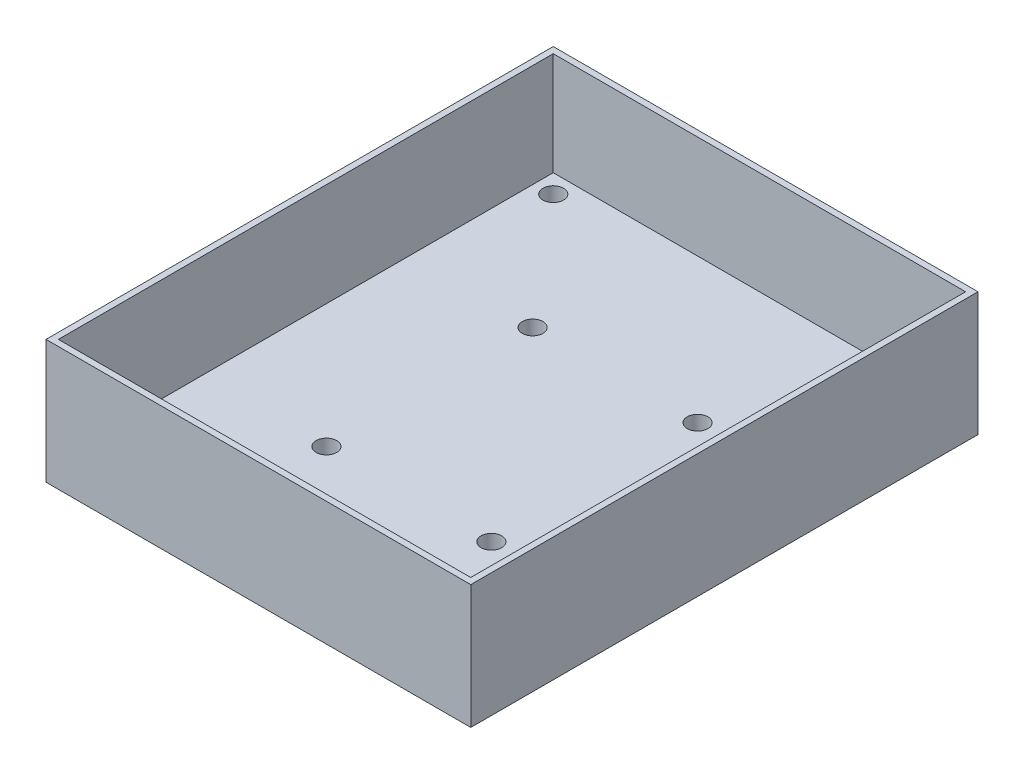
ISO-10303-21;
HEADER;
FILE_DESCRIPTION(('STEP AP214'),'2;1');
FILE_NAME('part.step','',(''),(''),'','','');
FILE_SCHEMA(('AUTOMOTIVE_DESIGN { 1 0 10303 214 1 1 1 1 }'));
ENDSEC;
DATA;
#1=APPLICATION_CONTEXT('core data for automotive mechanical design processes');
#2=APPLICATION_PROTOCOL_DEFINITION('international standard','automotive_design',2000,#1);
#3=PRODUCT_CONTEXT('',#1,'mechanical');
#4=PRODUCT('Part','Part','',(#3));
#5=PRODUCT_RELATED_PRODUCT_CATEGORY('part','',(#4));
#6=PRODUCT_DEFINITION_FORMATION('','',#4);
#7=PRODUCT_DEFINITION_CONTEXT('part definition',#1,'design');
#8=PRODUCT_DEFINITION('design','',#6,#7);
#9=PRODUCT_DEFINITION_SHAPE('','',#8);
#10=(LENGTH_UNIT() NAMED_UNIT(*) SI_UNIT(.MILLI.,.METRE.));
#11=(NAMED_UNIT(*) PLANE_ANGLE_UNIT() SI_UNIT($,.RADIAN.));
#12=(NAMED_UNIT(*) SI_UNIT($,.STERADIAN.) SOLID_ANGLE_UNIT());
#13=UNCERTAINTY_MEASURE_WITH_UNIT(LENGTH_MEASURE(1.E-05),#10,'distance_accuracy_value','');
#14=(GEOMETRIC_REPRESENTATION_CONTEXT(3) GLOBAL_UNCERTAINTY_ASSIGNED_CONTEXT((#13)) GLOBAL_UNIT_ASSIGNED_CONTEXT((#10,
#11,#12)) REPRESENTATION_CONTEXT('',''));
#15=CARTESIAN_POINT('',(0.,0.,0.));
#16=DIRECTION('',(0.,0.,1.));
#17=DIRECTION('',(1.,0.,0.));
#18=AXIS2_PLACEMENT_3D('',#15,#16,#17);
#19=CARTESIAN_POINT('',(103.,60.,-123.));
#20=DIRECTION('',(-1.,0.,0.));
#21=DIRECTION('',(0.,0.,1.));
#22=AXIS2_PLACEMENT_3D('',#19,#20,#21);
#23=PLANE('',#22);
#24=DIRECTION('',(0.,0.,-1.));
#25=VECTOR('',#24,1.);
#26=CARTESIAN_POINT('',(103.,0.,-123.));
#27=LINE('',#26,#25);
#28=CARTESIAN_POINT('',(103.,0.,123.));
#29=VERTEX_POINT('',#28);
#30=CARTESIAN_POINT('',(103.,0.,-123.));
#31=VERTEX_POINT('',#30);
#32=EDGE_CURVE('E146',#29,#31,#27,.T.);
#33=ORIENTED_EDGE('',*,*,#32,.T.);
#34=DIRECTION('',(0.,-1.,0.));
#35=VECTOR('',#34,1.);
#36=CARTESIAN_POINT('',(103.,60.,-123.));
#37=LINE('',#36,#35);
#38=CARTESIAN_POINT('',(103.,60.,-123.));
#39=VERTEX_POINT('',#38);
#40=EDGE_CURVE('E11',#39,#31,#37,.T.);
#41=ORIENTED_EDGE('',*,*,#40,.F.);
#42=DIRECTION('',(0.,0.,-1.));
#43=VECTOR('',#42,1.);
#44=CARTESIAN_POINT('',(103.,60.,-123.));
#45=LINE('',#44,#43);
#46=CARTESIAN_POINT('',(103.,60.,123.));
#47=VERTEX_POINT('',#46);
#48=EDGE_CURVE('E150',#47,#39,#45,.T.);
#49=ORIENTED_EDGE('',*,*,#48,.F.);
#50=DIRECTION('',(0.,-1.,0.));
#51=VECTOR('',#50,1.);
#52=CARTESIAN_POINT('',(103.,60.,123.));
#53=LINE('',#52,#51);
#54=EDGE_CURVE('E156',#47,#29,#53,.T.);
#55=ORIENTED_EDGE('',*,*,#54,.T.);
#56=EDGE_LOOP('',(#33,#41,#49,#55));
#57=FACE_BOUND('',#56,.T.);
#58=ADVANCED_FACE('F33',(#57),#23,.F.);
#59=CARTESIAN_POINT('',(-103.,60.,-123.));
#60=DIRECTION('',(0.,0.,1.));
#61=DIRECTION('',(1.,0.,0.));
#62=AXIS2_PLACEMENT_3D('',#59,#60,#61);
#63=PLANE('',#62);
#64=DIRECTION('',(-1.,0.,0.));
#65=VECTOR('',#64,1.);
#66=CARTESIAN_POINT('',(-103.,0.,-123.));
#67=LINE('',#66,#65);
#68=CARTESIAN_POINT('',(-103.,0.,-123.));
#69=VERTEX_POINT('',#68);
#70=EDGE_CURVE('E159',#31,#69,#67,.T.);
#71=ORIENTED_EDGE('',*,*,#70,.T.);
#72=DIRECTION('',(0.,-1.,0.));
#73=VECTOR('',#72,1.);
#74=CARTESIAN_POINT('',(-103.,60.,-123.));
#75=LINE('',#74,#73);
#76=CARTESIAN_POINT('',(-103.,60.,-123.));
#77=VERTEX_POINT('',#76);
#78=EDGE_CURVE('E41',#77,#69,#75,.T.);
#79=ORIENTED_EDGE('',*,*,#78,.F.);
#80=DIRECTION('',(-1.,0.,0.));
#81=VECTOR('',#80,1.);
#82=CARTESIAN_POINT('',(-103.,60.,-123.));
#83=LINE('',#82,#81);
#84=EDGE_CURVE('E86',#39,#77,#83,.T.);
#85=ORIENTED_EDGE('',*,*,#84,.F.);
#86=ORIENTED_EDGE('',*,*,#40,.T.);
#87=EDGE_LOOP('',(#71,#79,#85,#86));
#88=FACE_BOUND('',#87,.T.);
#89=ADVANCED_FACE('F264',(#88),#63,.F.);
#90=CARTESIAN_POINT('',(-103.,60.,-123.));
#91=DIRECTION('',(1.,0.,0.));
#92=DIRECTION('',(0.,0.,-1.));
#93=AXIS2_PLACEMENT_3D('',#90,#91,#92);
#94=PLANE('',#93);
#95=DIRECTION('',(0.,0.,1.));
#96=VECTOR('',#95,1.);
#97=CARTESIAN_POINT('',(-103.,0.,-123.));
#98=LINE('',#97,#96);
#99=CARTESIAN_POINT('',(-103.,0.,123.));
#100=VERTEX_POINT('',#99);
#101=EDGE_CURVE('E161',#69,#100,#98,.T.);
#102=ORIENTED_EDGE('',*,*,#101,.T.);
#103=DIRECTION('',(0.,-1.,0.));
#104=VECTOR('',#103,1.);
#105=CARTESIAN_POINT('',(-103.,60.,123.));
#106=LINE('',#105,#104);
#107=CARTESIAN_POINT('',(-103.,60.,123.));
#108=VERTEX_POINT('',#107);
#109=EDGE_CURVE('E165',#108,#100,#106,.T.);
#110=ORIENTED_EDGE('',*,*,#109,.F.);
#111=DIRECTION('',(0.,0.,1.));
#112=VECTOR('',#111,1.);
#113=CARTESIAN_POINT('',(-103.,60.,-123.));
#114=LINE('',#113,#112);
#115=EDGE_CURVE('E153',#77,#108,#114,.T.);
#116=ORIENTED_EDGE('',*,*,#115,.F.);
#117=ORIENTED_EDGE('',*,*,#78,.T.);
#118=EDGE_LOOP('',(#102,#110,#116,#117));
#119=FACE_BOUND('',#118,.T.);
#120=ADVANCED_FACE('F263',(#119),#94,.F.);
#121=CARTESIAN_POINT('',(-103.,60.,123.));
#122=DIRECTION('',(0.,0.,-1.));
#123=DIRECTION('',(-1.,0.,0.));
#124=AXIS2_PLACEMENT_3D('',#121,#122,#123);
#125=PLANE('',#124);
#126=DIRECTION('',(1.,0.,0.));
#127=VECTOR('',#126,1.);
#128=CARTESIAN_POINT('',(-103.,0.,123.));
#129=LINE('',#128,#127);
#130=EDGE_CURVE('E79',#100,#29,#129,.T.);
#131=ORIENTED_EDGE('',*,*,#130,.T.);
#132=ORIENTED_EDGE('',*,*,#54,.F.);
#133=DIRECTION('',(1.,0.,0.));
#134=VECTOR('',#133,1.);
#135=CARTESIAN_POINT('',(-103.,60.,123.));
#136=LINE('',#135,#134);
#137=EDGE_CURVE('E58',#108,#47,#136,.T.);
#138=ORIENTED_EDGE('',*,*,#137,.F.);
#139=ORIENTED_EDGE('',*,*,#109,.T.);
#140=EDGE_LOOP('',(#131,#132,#138,#139));
#141=FACE_BOUND('',#140,.T.);
#142=ADVANCED_FACE('F259',(#141),#125,.F.);
#143=CARTESIAN_POINT('',(0.,60.,0.));
#144=DIRECTION('',(0.,1.,0.));
#145=DIRECTION('',(0.,0.,1.));
#146=AXIS2_PLACEMENT_3D('',#143,#144,#145);
#147=PLANE('',#146);
#148=DIRECTION('',(0.,0.,-1.));
#149=VECTOR('',#148,1.);
#150=CARTESIAN_POINT('',(100.,60.,-120.));
#151=LINE('',#150,#149);
#152=CARTESIAN_POINT('',(100.,60.,120.));
#153=VERTEX_POINT('',#152);
#154=CARTESIAN_POINT('',(100.,60.,-120.));
#155=VERTEX_POINT('',#154);
#156=EDGE_CURVE('E49',#153,#155,#151,.T.);
#157=ORIENTED_EDGE('',*,*,#156,.F.);
#158=DIRECTION('',(1.,0.,0.));
#159=VECTOR('',#158,1.);
#160=CARTESIAN_POINT('',(-100.,60.,120.));
#161=LINE('',#160,#159);
#162=CARTESIAN_POINT('',(-100.,60.,120.));
#163=VERTEX_POINT('',#162);
#164=EDGE_CURVE('E128',#163,#153,#161,.T.);
#165=ORIENTED_EDGE('',*,*,#164,.F.);
#166=DIRECTION('',(0.,0.,1.));
#167=VECTOR('',#166,1.);
#168=CARTESIAN_POINT('',(-100.,60.,-120.));
#169=LINE('',#168,#167);
#170=CARTESIAN_POINT('',(-100.,60.,-120.));
#171=VERTEX_POINT('',#170);
#172=EDGE_CURVE('E131',#171,#163,#169,.T.);
#173=ORIENTED_EDGE('',*,*,#172,.F.);
#174=DIRECTION('',(-1.,0.,0.));
#175=VECTOR('',#174,1.);
#176=CARTESIAN_POINT('',(-100.,60.,-120.));
#177=LINE('',#176,#175);
#178=EDGE_CURVE('E140',#155,#171,#177,.T.);
#179=ORIENTED_EDGE('',*,*,#178,.F.);
#180=EDGE_LOOP('',(#157,#165,#173,#179));
#181=FACE_BOUND('',#180,.T.);
#182=ORIENTED_EDGE('',*,*,#48,.T.);
#183=ORIENTED_EDGE('',*,*,#84,.T.);
#184=ORIENTED_EDGE('',*,*,#115,.T.);
#185=ORIENTED_EDGE('',*,*,#137,.T.);
#186=EDGE_LOOP('',(#182,#183,#184,#185));
#187=FACE_BOUND('',#186,.T.);
#188=ADVANCED_FACE('F245',(#181,#187),#147,.T.);
#189=CARTESIAN_POINT('',(0.,0.,0.));
#190=DIRECTION('',(0.,1.,0.));
#191=DIRECTION('',(0.,0.,1.));
#192=AXIS2_PLACEMENT_3D('',#189,#190,#191);
#193=PLANE('',#192);
#194=CARTESIAN_POINT('',(40.,0.,50.));
#195=DIRECTION('',(0.,-1.,0.));
#196=DIRECTION('',(0.,0.,-1.));
#197=AXIS2_PLACEMENT_3D('',#194,#195,#196);
#198=CIRCLE('',#197,5.);
#199=CARTESIAN_POINT('',(40.,0.,45.));
#200=VERTEX_POINT('',#199);
#201=EDGE_CURVE('E225',#200,#200,#198,.T.);
#202=ORIENTED_EDGE('',*,*,#201,.F.);
#203=EDGE_LOOP('',(#202));
#204=FACE_BOUND('',#203,.T.);
#205=CARTESIAN_POINT('',(-40.,0.,50.));
#206=DIRECTION('',(0.,-1.,0.));
#207=DIRECTION('',(0.,0.,-1.));
#208=AXIS2_PLACEMENT_3D('',#205,#206,#207);
#209=CIRCLE('',#208,5.);
#210=CARTESIAN_POINT('',(-40.,0.,45.));
#211=VERTEX_POINT('',#210);
#212=EDGE_CURVE('E231',#211,#211,#209,.T.);
#213=ORIENTED_EDGE('',*,*,#212,.F.);
#214=EDGE_LOOP('',(#213));
#215=FACE_BOUND('',#214,.T.);
#216=CARTESIAN_POINT('',(-40.,0.,-50.));
#217=DIRECTION('',(0.,-1.,0.));
#218=DIRECTION('',(0.,0.,-1.));
#219=AXIS2_PLACEMENT_3D('',#216,#217,#218);
#220=CIRCLE('',#219,5.);
#221=CARTESIAN_POINT('',(-40.,0.,-55.));
#222=VERTEX_POINT('',#221);
#223=EDGE_CURVE('E220',#222,#222,#220,.T.);
#224=ORIENTED_EDGE('',*,*,#223,.F.);
#225=EDGE_LOOP('',(#224));
#226=FACE_BOUND('',#225,.T.);
#227=CARTESIAN_POINT('',(40.,0.,-50.));
#228=DIRECTION('',(0.,-1.,0.));
#229=DIRECTION('',(0.,0.,-1.));
#230=AXIS2_PLACEMENT_3D('',#227,#228,#229);
#231=CIRCLE('',#230,5.);
#232=CARTESIAN_POINT('',(40.,0.,-55.));
#233=VERTEX_POINT('',#232);
#234=EDGE_CURVE('E211',#233,#233,#231,.T.);
#235=ORIENTED_EDGE('',*,*,#234,.F.);
#236=EDGE_LOOP('',(#235));
#237=FACE_BOUND('',#236,.T.);
#238=CARTESIAN_POINT('',(-91.,0.,-111.));
#239=DIRECTION('',(0.,-1.,0.));
#240=DIRECTION('',(0.,0.,-1.));
#241=AXIS2_PLACEMENT_3D('',#238,#239,#240);
#242=CIRCLE('',#241,5.00000000000001);
#243=CARTESIAN_POINT('',(-91.,0.,-116.));
#244=VERTEX_POINT('',#243);
#245=EDGE_CURVE('E208',#244,#244,#242,.T.);
#246=ORIENTED_EDGE('',*,*,#245,.F.);
#247=EDGE_LOOP('',(#246));
#248=FACE_BOUND('',#247,.T.);
#249=CARTESIAN_POINT('',(91.,0.,-111.));
#250=DIRECTION('',(0.,-1.,0.));
#251=DIRECTION('',(0.,0.,-1.));
#252=AXIS2_PLACEMENT_3D('',#249,#250,#251);
#253=CIRCLE('',#252,5.00000000000001);
#254=CARTESIAN_POINT('',(91.,0.,-116.));
#255=VERTEX_POINT('',#254);
#256=EDGE_CURVE('E203',#255,#255,#253,.T.);
#257=ORIENTED_EDGE('',*,*,#256,.F.);
#258=EDGE_LOOP('',(#257));
#259=FACE_BOUND('',#258,.T.);
#260=CARTESIAN_POINT('',(91.,0.,111.));
#261=DIRECTION('',(0.,-1.,0.));
#262=DIRECTION('',(0.,0.,-1.));
#263=AXIS2_PLACEMENT_3D('',#260,#261,#262);
#264=CIRCLE('',#263,5.00000000000001);
#265=CARTESIAN_POINT('',(91.,0.,106.));
#266=VERTEX_POINT('',#265);
#267=EDGE_CURVE('E201',#266,#266,#264,.T.);
#268=ORIENTED_EDGE('',*,*,#267,.F.);
#269=EDGE_LOOP('',(#268));
#270=FACE_BOUND('',#269,.T.);
#271=CARTESIAN_POINT('',(-91.,0.,111.));
#272=DIRECTION('',(0.,-1.,0.));
#273=DIRECTION('',(0.,0.,-1.));
#274=AXIS2_PLACEMENT_3D('',#271,#272,#273);
#275=CIRCLE('',#274,5.00000000000001);
#276=CARTESIAN_POINT('',(-91.,0.,106.));
#277=VERTEX_POINT('',#276);
#278=EDGE_CURVE('E134',#277,#277,#275,.T.);
#279=ORIENTED_EDGE('',*,*,#278,.F.);
#280=EDGE_LOOP('',(#279));
#281=FACE_BOUND('',#280,.T.);
#282=ORIENTED_EDGE('',*,*,#32,.F.);
#283=ORIENTED_EDGE('',*,*,#130,.F.);
#284=ORIENTED_EDGE('',*,*,#101,.F.);
#285=ORIENTED_EDGE('',*,*,#70,.F.);
#286=EDGE_LOOP('',(#282,#283,#284,#285));
#287=FACE_BOUND('',#286,.T.);
#288=ADVANCED_FACE('F242',(#204,#215,#226,#237,#248,#259,#270,#281,#287),#193,.F.);
#289=CARTESIAN_POINT('',(100.,10.,-120.));
#290=DIRECTION('',(1.,0.,0.));
#291=DIRECTION('',(0.,0.,-1.));
#292=AXIS2_PLACEMENT_3D('',#289,#290,#291);
#293=PLANE('',#292);
#294=ORIENTED_EDGE('',*,*,#156,.T.);
#295=DIRECTION('',(0.,1.,0.));
#296=VECTOR('',#295,1.);
#297=CARTESIAN_POINT('',(100.,10.,-120.));
#298=LINE('',#297,#296);
#299=CARTESIAN_POINT('',(100.,10.,-120.));
#300=VERTEX_POINT('',#299);
#301=EDGE_CURVE('E106',#300,#155,#298,.T.);
#302=ORIENTED_EDGE('',*,*,#301,.F.);
#303=DIRECTION('',(0.,0.,-1.));
#304=VECTOR('',#303,1.);
#305=CARTESIAN_POINT('',(100.,10.,-120.));
#306=LINE('',#305,#304);
#307=CARTESIAN_POINT('',(100.,10.,120.));
#308=VERTEX_POINT('',#307);
#309=EDGE_CURVE('E110',#308,#300,#306,.T.);
#310=ORIENTED_EDGE('',*,*,#309,.F.);
#311=DIRECTION('',(0.,1.,0.));
#312=VECTOR('',#311,1.);
#313=CARTESIAN_POINT('',(100.,10.,120.));
#314=LINE('',#313,#312);
#315=EDGE_CURVE('E144',#308,#153,#314,.T.);
#316=ORIENTED_EDGE('',*,*,#315,.T.);
#317=EDGE_LOOP('',(#294,#302,#310,#316));
#318=FACE_BOUND('',#317,.T.);
#319=ADVANCED_FACE('F108',(#318),#293,.F.);
#320=CARTESIAN_POINT('',(-100.,10.,120.));
#321=DIRECTION('',(0.,0.,1.));
#322=DIRECTION('',(1.,0.,0.));
#323=AXIS2_PLACEMENT_3D('',#320,#321,#322);
#324=PLANE('',#323);
#325=ORIENTED_EDGE('',*,*,#164,.T.);
#326=ORIENTED_EDGE('',*,*,#315,.F.);
#327=DIRECTION('',(1.,0.,0.));
#328=VECTOR('',#327,1.);
#329=CARTESIAN_POINT('',(-100.,10.,120.));
#330=LINE('',#329,#328);
#331=CARTESIAN_POINT('',(-100.,10.,120.));
#332=VERTEX_POINT('',#331);
#333=EDGE_CURVE('E116',#332,#308,#330,.T.);
#334=ORIENTED_EDGE('',*,*,#333,.F.);
#335=DIRECTION('',(0.,1.,0.));
#336=VECTOR('',#335,1.);
#337=CARTESIAN_POINT('',(-100.,10.,120.));
#338=LINE('',#337,#336);
#339=EDGE_CURVE('E147',#332,#163,#338,.T.);
#340=ORIENTED_EDGE('',*,*,#339,.T.);
#341=EDGE_LOOP('',(#325,#326,#334,#340));
#342=FACE_BOUND('',#341,.T.);
#343=ADVANCED_FACE('F279',(#342),#324,.F.);
#344=CARTESIAN_POINT('',(-100.,10.,-120.));
#345=DIRECTION('',(-1.,0.,0.));
#346=DIRECTION('',(0.,0.,1.));
#347=AXIS2_PLACEMENT_3D('',#344,#345,#346);
#348=PLANE('',#347);
#349=ORIENTED_EDGE('',*,*,#172,.T.);
#350=ORIENTED_EDGE('',*,*,#339,.F.);
#351=DIRECTION('',(0.,0.,1.));
#352=VECTOR('',#351,1.);
#353=CARTESIAN_POINT('',(-100.,10.,-120.));
#354=LINE('',#353,#352);
#355=CARTESIAN_POINT('',(-100.,10.,-120.));
#356=VERTEX_POINT('',#355);
#357=EDGE_CURVE('E124',#356,#332,#354,.T.);
#358=ORIENTED_EDGE('',*,*,#357,.F.);
#359=DIRECTION('',(0.,1.,0.));
#360=VECTOR('',#359,1.);
#361=CARTESIAN_POINT('',(-100.,10.,-120.));
#362=LINE('',#361,#360);
#363=EDGE_CURVE('E115',#356,#171,#362,.T.);
#364=ORIENTED_EDGE('',*,*,#363,.T.);
#365=EDGE_LOOP('',(#349,#350,#358,#364));
#366=FACE_BOUND('',#365,.T.);
#367=ADVANCED_FACE('F282',(#366),#348,.F.);
#368=CARTESIAN_POINT('',(-100.,10.,-120.));
#369=DIRECTION('',(0.,0.,-1.));
#370=DIRECTION('',(-1.,0.,0.));
#371=AXIS2_PLACEMENT_3D('',#368,#369,#370);
#372=PLANE('',#371);
#373=ORIENTED_EDGE('',*,*,#178,.T.);
#374=ORIENTED_EDGE('',*,*,#363,.F.);
#375=DIRECTION('',(-1.,0.,0.));
#376=VECTOR('',#375,1.);
#377=CARTESIAN_POINT('',(-100.,10.,-120.));
#378=LINE('',#377,#376);
#379=EDGE_CURVE('E119',#300,#356,#378,.T.);
#380=ORIENTED_EDGE('',*,*,#379,.F.);
#381=ORIENTED_EDGE('',*,*,#301,.T.);
#382=EDGE_LOOP('',(#373,#374,#380,#381));
#383=FACE_BOUND('',#382,.T.);
#384=ADVANCED_FACE('F120',(#383),#372,.F.);
#385=CARTESIAN_POINT('',(0.,10.,0.));
#386=DIRECTION('',(0.,1.,0.));
#387=DIRECTION('',(0.,0.,1.));
#388=AXIS2_PLACEMENT_3D('',#385,#386,#387);
#389=PLANE('',#388);
#390=CARTESIAN_POINT('',(40.,10.,50.));
#391=DIRECTION('',(0.,-1.,0.));
#392=DIRECTION('',(0.,0.,-1.));
#393=AXIS2_PLACEMENT_3D('',#390,#391,#392);
#394=CIRCLE('',#393,5.);
#395=CARTESIAN_POINT('',(40.,10.,45.));
#396=VERTEX_POINT('',#395);
#397=EDGE_CURVE('E222',#396,#396,#394,.T.);
#398=ORIENTED_EDGE('',*,*,#397,.T.);
#399=EDGE_LOOP('',(#398));
#400=FACE_BOUND('',#399,.T.);
#401=CARTESIAN_POINT('',(-40.,10.,50.));
#402=DIRECTION('',(0.,-1.,0.));
#403=DIRECTION('',(0.,0.,-1.));
#404=AXIS2_PLACEMENT_3D('',#401,#402,#403);
#405=CIRCLE('',#404,5.);
#406=CARTESIAN_POINT('',(-40.,10.,45.));
#407=VERTEX_POINT('',#406);
#408=EDGE_CURVE('E228',#407,#407,#405,.T.);
#409=ORIENTED_EDGE('',*,*,#408,.T.);
#410=EDGE_LOOP('',(#409));
#411=FACE_BOUND('',#410,.T.);
#412=CARTESIAN_POINT('',(-40.,10.,-50.));
#413=DIRECTION('',(0.,-1.,0.));
#414=DIRECTION('',(0.,0.,-1.));
#415=AXIS2_PLACEMENT_3D('',#412,#413,#414);
#416=CIRCLE('',#415,5.);
#417=CARTESIAN_POINT('',(-40.,10.,-55.));
#418=VERTEX_POINT('',#417);
#419=EDGE_CURVE('E234',#418,#418,#416,.T.);
#420=ORIENTED_EDGE('',*,*,#419,.T.);
#421=EDGE_LOOP('',(#420));
#422=FACE_BOUND('',#421,.T.);
#423=CARTESIAN_POINT('',(40.,10.,-50.));
#424=DIRECTION('',(0.,-1.,0.));
#425=DIRECTION('',(0.,0.,-1.));
#426=AXIS2_PLACEMENT_3D('',#423,#424,#425);
#427=CIRCLE('',#426,5.);
#428=CARTESIAN_POINT('',(40.,10.,-55.));
#429=VERTEX_POINT('',#428);
#430=EDGE_CURVE('E214',#429,#429,#427,.T.);
#431=ORIENTED_EDGE('',*,*,#430,.T.);
#432=EDGE_LOOP('',(#431));
#433=FACE_BOUND('',#432,.T.);
#434=CARTESIAN_POINT('',(-91.,10.,-111.));
#435=DIRECTION('',(0.,1.,0.));
#436=DIRECTION('',(0.,0.,1.));
#437=AXIS2_PLACEMENT_3D('',#434,#435,#436);
#438=CIRCLE('',#437,5.00000000000001);
#439=CARTESIAN_POINT('',(-91.,10.,-106.));
#440=VERTEX_POINT('',#439);
#441=EDGE_CURVE('E36',#440,#440,#438,.T.);
#442=ORIENTED_EDGE('',*,*,#441,.F.);
#443=EDGE_LOOP('',(#442));
#444=FACE_BOUND('',#443,.T.);
#445=CARTESIAN_POINT('',(91.,10.,-111.));
#446=DIRECTION('',(0.,1.,0.));
#447=DIRECTION('',(0.,0.,1.));
#448=AXIS2_PLACEMENT_3D('',#445,#446,#447);
#449=CIRCLE('',#448,5.00000000000001);
#450=CARTESIAN_POINT('',(91.,10.,-106.));
#451=VERTEX_POINT('',#450);
#452=EDGE_CURVE('E174',#451,#451,#449,.T.);
#453=ORIENTED_EDGE('',*,*,#452,.F.);
#454=EDGE_LOOP('',(#453));
#455=FACE_BOUND('',#454,.T.);
#456=CARTESIAN_POINT('',(91.,10.,111.));
#457=DIRECTION('',(0.,1.,0.));
#458=DIRECTION('',(0.,0.,1.));
#459=AXIS2_PLACEMENT_3D('',#456,#457,#458);
#460=CIRCLE('',#459,5.00000000000001);
#461=CARTESIAN_POINT('',(91.,10.,116.));
#462=VERTEX_POINT('',#461);
#463=EDGE_CURVE('E172',#462,#462,#460,.T.);
#464=ORIENTED_EDGE('',*,*,#463,.F.);
#465=EDGE_LOOP('',(#464));
#466=FACE_BOUND('',#465,.T.);
#467=CARTESIAN_POINT('',(-91.,10.,111.));
#468=DIRECTION('',(0.,1.,0.));
#469=DIRECTION('',(0.,0.,1.));
#470=AXIS2_PLACEMENT_3D('',#467,#468,#469);
#471=CIRCLE('',#470,5.00000000000001);
#472=CARTESIAN_POINT('',(-91.,10.,116.));
#473=VERTEX_POINT('',#472);
#474=EDGE_CURVE('E169',#473,#473,#471,.T.);
#475=ORIENTED_EDGE('',*,*,#474,.F.);
#476=EDGE_LOOP('',(#475));
#477=FACE_BOUND('',#476,.T.);
#478=ORIENTED_EDGE('',*,*,#309,.T.);
#479=ORIENTED_EDGE('',*,*,#379,.T.);
#480=ORIENTED_EDGE('',*,*,#357,.T.);
#481=ORIENTED_EDGE('',*,*,#333,.T.);
#482=EDGE_LOOP('',(#478,#479,#480,#481));
#483=FACE_BOUND('',#482,.T.);
#484=ADVANCED_FACE('F126',(#400,#411,#422,#433,#444,#455,#466,#477,#483),#389,.T.);
#485=CARTESIAN_POINT('',(-91.,60.,111.));
#486=DIRECTION('',(0.,-1.,0.));
#487=DIRECTION('',(0.,0.,-1.));
#488=AXIS2_PLACEMENT_3D('',#485,#486,#487);
#489=CYLINDRICAL_SURFACE('',#488,5.00000000000001);
#490=ORIENTED_EDGE('',*,*,#474,.T.);
#491=EDGE_LOOP('',(#490));
#492=FACE_BOUND('',#491,.T.);
#493=ORIENTED_EDGE('',*,*,#278,.T.);
#494=EDGE_LOOP('',(#493));
#495=FACE_BOUND('',#494,.T.);
#496=ADVANCED_FACE('F186',(#492,#495),#489,.F.);
#497=CARTESIAN_POINT('',(91.,60.,111.));
#498=DIRECTION('',(0.,-1.,0.));
#499=DIRECTION('',(0.,0.,-1.));
#500=AXIS2_PLACEMENT_3D('',#497,#498,#499);
#501=CYLINDRICAL_SURFACE('',#500,5.00000000000001);
#502=ORIENTED_EDGE('',*,*,#463,.T.);
#503=EDGE_LOOP('',(#502));
#504=FACE_BOUND('',#503,.T.);
#505=ORIENTED_EDGE('',*,*,#267,.T.);
#506=EDGE_LOOP('',(#505));
#507=FACE_BOUND('',#506,.T.);
#508=ADVANCED_FACE('F196',(#504,#507),#501,.F.);
#509=CARTESIAN_POINT('',(91.,60.,-111.));
#510=DIRECTION('',(0.,-1.,0.));
#511=DIRECTION('',(0.,0.,-1.));
#512=AXIS2_PLACEMENT_3D('',#509,#510,#511);
#513=CYLINDRICAL_SURFACE('',#512,5.00000000000001);
#514=ORIENTED_EDGE('',*,*,#452,.T.);
#515=EDGE_LOOP('',(#514));
#516=FACE_BOUND('',#515,.T.);
#517=ORIENTED_EDGE('',*,*,#256,.T.);
#518=EDGE_LOOP('',(#517));
#519=FACE_BOUND('',#518,.T.);
#520=ADVANCED_FACE('F292',(#516,#519),#513,.F.);
#521=CARTESIAN_POINT('',(-91.,60.,-111.));
#522=DIRECTION('',(0.,-1.,0.));
#523=DIRECTION('',(0.,0.,-1.));
#524=AXIS2_PLACEMENT_3D('',#521,#522,#523);
#525=CYLINDRICAL_SURFACE('',#524,5.00000000000001);
#526=ORIENTED_EDGE('',*,*,#441,.T.);
#527=EDGE_LOOP('',(#526));
#528=FACE_BOUND('',#527,.T.);
#529=ORIENTED_EDGE('',*,*,#245,.T.);
#530=EDGE_LOOP('',(#529));
#531=FACE_BOUND('',#530,.T.);
#532=ADVANCED_FACE('F181',(#528,#531),#525,.F.);
#533=CARTESIAN_POINT('',(40.,10.,-50.));
#534=DIRECTION('',(0.,-1.,0.));
#535=DIRECTION('',(0.,0.,-1.));
#536=AXIS2_PLACEMENT_3D('',#533,#534,#535);
#537=CYLINDRICAL_SURFACE('',#536,5.);
#538=ORIENTED_EDGE('',*,*,#430,.F.);
#539=EDGE_LOOP('',(#538));
#540=FACE_BOUND('',#539,.T.);
#541=ORIENTED_EDGE('',*,*,#234,.T.);
#542=EDGE_LOOP('',(#541));
#543=FACE_BOUND('',#542,.T.);
#544=ADVANCED_FACE('F291',(#540,#543),#537,.F.);
#545=CARTESIAN_POINT('',(-40.,10.,-50.));
#546=DIRECTION('',(0.,-1.,0.));
#547=DIRECTION('',(0.,0.,-1.));
#548=AXIS2_PLACEMENT_3D('',#545,#546,#547);
#549=CYLINDRICAL_SURFACE('',#548,5.);
#550=ORIENTED_EDGE('',*,*,#419,.F.);
#551=EDGE_LOOP('',(#550));
#552=FACE_BOUND('',#551,.T.);
#553=ORIENTED_EDGE('',*,*,#223,.T.);
#554=EDGE_LOOP('',(#553));
#555=FACE_BOUND('',#554,.T.);
#556=ADVANCED_FACE('F240',(#552,#555),#549,.F.);
#557=CARTESIAN_POINT('',(-40.,10.,50.));
#558=DIRECTION('',(0.,-1.,0.));
#559=DIRECTION('',(0.,0.,-1.));
#560=AXIS2_PLACEMENT_3D('',#557,#558,#559);
#561=CYLINDRICAL_SURFACE('',#560,5.);
#562=ORIENTED_EDGE('',*,*,#408,.F.);
#563=EDGE_LOOP('',(#562));
#564=FACE_BOUND('',#563,.T.);
#565=ORIENTED_EDGE('',*,*,#212,.T.);
#566=EDGE_LOOP('',(#565));
#567=FACE_BOUND('',#566,.T.);
#568=ADVANCED_FACE('F304',(#564,#567),#561,.F.);
#569=CARTESIAN_POINT('',(40.,10.,50.));
#570=DIRECTION('',(0.,-1.,0.));
#571=DIRECTION('',(0.,0.,-1.));
#572=AXIS2_PLACEMENT_3D('',#569,#570,#571);
#573=CYLINDRICAL_SURFACE('',#572,5.);
#574=ORIENTED_EDGE('',*,*,#397,.F.);
#575=EDGE_LOOP('',(#574));
#576=FACE_BOUND('',#575,.T.);
#577=ORIENTED_EDGE('',*,*,#201,.T.);
#578=EDGE_LOOP('',(#577));
#579=FACE_BOUND('',#578,.T.);
#580=ADVANCED_FACE('F301',(#576,#579),#573,.F.);
#581=CLOSED_SHELL('',(#58,#89,#120,#142,#188,#288,#319,#343,#367,#384,#484,#496,#508,#520,#532,
#544,#556,#568,#580));
#582=MANIFOLD_SOLID_BREP('B2',#581);
#583=ADVANCED_BREP_SHAPE_REPRESENTATION('',(#18,#582),#14);
#584=SHAPE_DEFINITION_REPRESENTATION(#9,#583);
ENDSEC;
END-ISO-10303-21;
